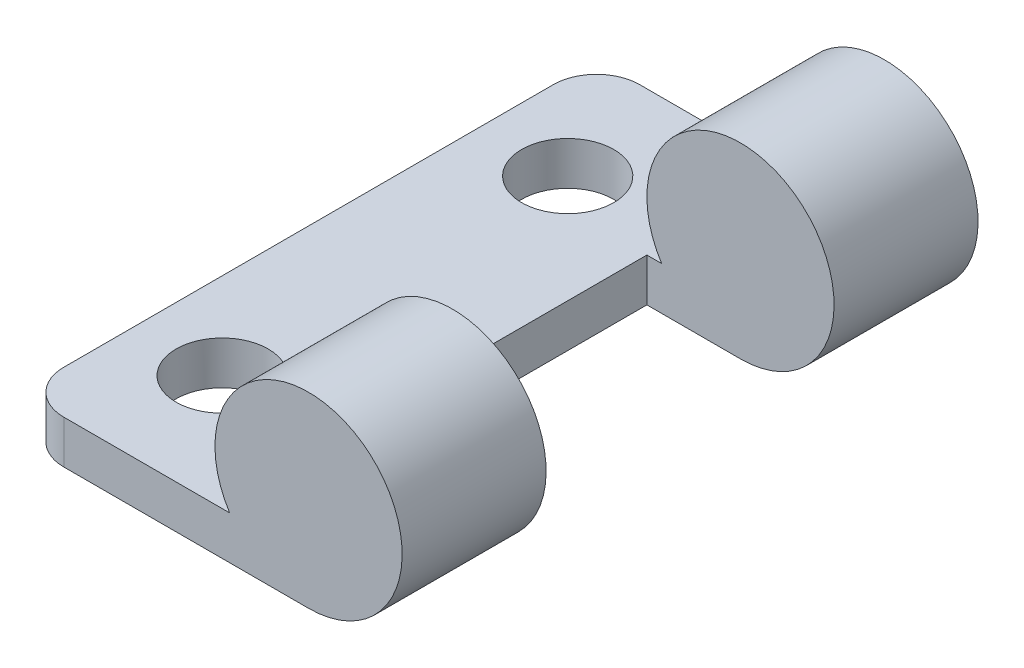
ISO-10303-21;
HEADER;
FILE_DESCRIPTION(('STEP AP214'),'2;1');
FILE_NAME('part.step','',(''),(''),'','','');
FILE_SCHEMA(('AUTOMOTIVE_DESIGN { 1 0 10303 214 1 1 1 1 }'));
ENDSEC;
DATA;
#1=APPLICATION_CONTEXT('core data for automotive mechanical design processes');
#2=APPLICATION_PROTOCOL_DEFINITION('international standard','automotive_design',2000,#1);
#3=PRODUCT_CONTEXT('',#1,'mechanical');
#4=PRODUCT('Part','Part','',(#3));
#5=PRODUCT_RELATED_PRODUCT_CATEGORY('part','',(#4));
#6=PRODUCT_DEFINITION_FORMATION('','',#4);
#7=PRODUCT_DEFINITION_CONTEXT('part definition',#1,'design');
#8=PRODUCT_DEFINITION('design','',#6,#7);
#9=PRODUCT_DEFINITION_SHAPE('','',#8);
#10=(LENGTH_UNIT() NAMED_UNIT(*) SI_UNIT(.MILLI.,.METRE.));
#11=(NAMED_UNIT(*) PLANE_ANGLE_UNIT() SI_UNIT($,.RADIAN.));
#12=(NAMED_UNIT(*) SI_UNIT($,.STERADIAN.) SOLID_ANGLE_UNIT());
#13=UNCERTAINTY_MEASURE_WITH_UNIT(LENGTH_MEASURE(1.E-05),#10,'distance_accuracy_value','');
#14=(GEOMETRIC_REPRESENTATION_CONTEXT(3) GLOBAL_UNCERTAINTY_ASSIGNED_CONTEXT((#13)) GLOBAL_UNIT_ASSIGNED_CONTEXT((#10,
#11,#12)) REPRESENTATION_CONTEXT('',''));
#15=CARTESIAN_POINT('',(0.,0.,0.));
#16=DIRECTION('',(0.,0.,1.));
#17=DIRECTION('',(1.,0.,0.));
#18=AXIS2_PLACEMENT_3D('',#15,#16,#17);
#19=CARTESIAN_POINT('',(0.,0.,10.));
#20=DIRECTION('',(0.,0.,-1.));
#21=DIRECTION('',(-1.,0.,0.));
#22=AXIS2_PLACEMENT_3D('',#19,#20,#21);
#23=CYLINDRICAL_SURFACE('',#22,3.25);
#24=DIRECTION('',(0.,0.,-1.));
#25=VECTOR('',#24,1.);
#26=CARTESIAN_POINT('',(-2.73861278752583,-1.75,10.));
#27=LINE('',#26,#25);
#28=CARTESIAN_POINT('',(-2.73861278752583,-1.75,-5.));
#29=VERTEX_POINT('',#28);
#30=CARTESIAN_POINT('',(-2.73861278752583,-1.75,-10.));
#31=VERTEX_POINT('',#30);
#32=EDGE_CURVE('E188',#29,#31,#27,.T.);
#33=ORIENTED_EDGE('',*,*,#32,.F.);
#34=CARTESIAN_POINT('',(0.,0.,-5.));
#35=DIRECTION('',(0.,0.,-1.));
#36=DIRECTION('',(-1.,0.,0.));
#37=AXIS2_PLACEMENT_3D('',#34,#35,#36);
#38=CIRCLE('',#37,3.25);
#39=CARTESIAN_POINT('',(0.,-3.25,-5.));
#40=VERTEX_POINT('',#39);
#41=EDGE_CURVE('E163',#29,#40,#38,.T.);
#42=ORIENTED_EDGE('',*,*,#41,.T.);
#43=DIRECTION('',(0.,0.,-1.));
#44=VECTOR('',#43,1.);
#45=CARTESIAN_POINT('',(0.,-3.25,10.));
#46=LINE('',#45,#44);
#47=CARTESIAN_POINT('',(0.,-3.25,-10.));
#48=VERTEX_POINT('',#47);
#49=EDGE_CURVE('E175',#40,#48,#46,.T.);
#50=ORIENTED_EDGE('',*,*,#49,.T.);
#51=CARTESIAN_POINT('',(0.,0.,-10.));
#52=DIRECTION('',(0.,0.,1.));
#53=DIRECTION('',(1.,0.,0.));
#54=AXIS2_PLACEMENT_3D('',#51,#52,#53);
#55=CIRCLE('',#54,3.25);
#56=EDGE_CURVE('E166',#48,#31,#55,.T.);
#57=ORIENTED_EDGE('',*,*,#56,.T.);
#58=EDGE_LOOP('',(#33,#42,#50,#57));
#59=FACE_BOUND('',#58,.T.);
#60=ADVANCED_FACE('F36',(#59),#23,.T.);
#61=CARTESIAN_POINT('',(0.,0.,5.));
#62=DIRECTION('',(0.,0.,1.));
#63=DIRECTION('',(1.,0.,0.));
#64=AXIS2_PLACEMENT_3D('',#61,#62,#63);
#65=CIRCLE('',#64,3.25);
#66=CARTESIAN_POINT('',(0.,-3.25,5.));
#67=VERTEX_POINT('',#66);
#68=CARTESIAN_POINT('',(-2.73861278752583,-1.75,5.));
#69=VERTEX_POINT('',#68);
#70=EDGE_CURVE('E133',#67,#69,#65,.T.);
#71=ORIENTED_EDGE('',*,*,#70,.T.);
#72=CARTESIAN_POINT('',(-2.73861278752583,-1.75,10.));
#73=VERTEX_POINT('',#72);
#74=EDGE_CURVE('E189',#73,#69,#27,.T.);
#75=ORIENTED_EDGE('',*,*,#74,.F.);
#76=CARTESIAN_POINT('',(0.,0.,10.));
#77=DIRECTION('',(0.,0.,1.));
#78=DIRECTION('',(1.,0.,0.));
#79=AXIS2_PLACEMENT_3D('',#76,#77,#78);
#80=CIRCLE('',#79,3.25);
#81=CARTESIAN_POINT('',(0.,-3.25,10.));
#82=VERTEX_POINT('',#81);
#83=EDGE_CURVE('E167',#82,#73,#80,.T.);
#84=ORIENTED_EDGE('',*,*,#83,.F.);
#85=EDGE_CURVE('E181',#82,#67,#46,.T.);
#86=ORIENTED_EDGE('',*,*,#85,.T.);
#87=EDGE_LOOP('',(#71,#75,#84,#86));
#88=FACE_BOUND('',#87,.T.);
#89=ADVANCED_FACE('F222',(#88),#23,.T.);
#90=CARTESIAN_POINT('',(-10.,-1.75,10.));
#91=DIRECTION('',(0.,-1.,0.));
#92=DIRECTION('',(0.,0.,-1.));
#93=AXIS2_PLACEMENT_3D('',#90,#91,#92);
#94=PLANE('',#93);
#95=CARTESIAN_POINT('',(-7.,-1.75,-6.));
#96=DIRECTION('',(0.,-1.,0.));
#97=DIRECTION('',(0.,0.,-1.));
#98=AXIS2_PLACEMENT_3D('',#95,#96,#97);
#99=CIRCLE('',#98,1.6);
#100=CARTESIAN_POINT('',(-7.,-1.75,-7.6));
#101=VERTEX_POINT('',#100);
#102=EDGE_CURVE('E154',#101,#101,#99,.T.);
#103=ORIENTED_EDGE('',*,*,#102,.T.);
#104=EDGE_LOOP('',(#103));
#105=FACE_BOUND('',#104,.T.);
#106=CARTESIAN_POINT('',(-7.,-1.75,6.));
#107=DIRECTION('',(0.,-1.,0.));
#108=DIRECTION('',(0.,0.,-1.));
#109=AXIS2_PLACEMENT_3D('',#106,#107,#108);
#110=CIRCLE('',#109,1.6);
#111=CARTESIAN_POINT('',(-7.,-1.75,4.4));
#112=VERTEX_POINT('',#111);
#113=EDGE_CURVE('E151',#112,#112,#110,.T.);
#114=ORIENTED_EDGE('',*,*,#113,.T.);
#115=EDGE_LOOP('',(#114));
#116=FACE_BOUND('',#115,.T.);
#117=DIRECTION('',(-1.,0.,0.));
#118=VECTOR('',#117,1.);
#119=CARTESIAN_POINT('',(-10.,-1.75,-10.));
#120=LINE('',#119,#118);
#121=CARTESIAN_POINT('',(-8.5,-1.75,-10.));
#122=VERTEX_POINT('',#121);
#123=EDGE_CURVE('E178',#31,#122,#120,.T.);
#124=ORIENTED_EDGE('',*,*,#123,.T.);
#125=CARTESIAN_POINT('',(-8.5,-1.75,-8.5));
#126=DIRECTION('',(0.,-1.,0.));
#127=DIRECTION('',(0.,0.,-1.));
#128=AXIS2_PLACEMENT_3D('',#125,#126,#127);
#129=CIRCLE('',#128,1.5);
#130=CARTESIAN_POINT('',(-10.,-1.75,-8.5));
#131=VERTEX_POINT('',#130);
#132=EDGE_CURVE('E44',#122,#131,#129,.F.);
#133=ORIENTED_EDGE('',*,*,#132,.T.);
#134=DIRECTION('',(0.,0.,-1.));
#135=VECTOR('',#134,1.);
#136=CARTESIAN_POINT('',(-10.,-1.75,10.));
#137=LINE('',#136,#135);
#138=CARTESIAN_POINT('',(-10.,-1.75,8.5));
#139=VERTEX_POINT('',#138);
#140=EDGE_CURVE('E185',#139,#131,#137,.T.);
#141=ORIENTED_EDGE('',*,*,#140,.F.);
#142=CARTESIAN_POINT('',(-8.5,-1.75,8.5));
#143=DIRECTION('',(0.,-1.,0.));
#144=DIRECTION('',(0.,0.,-1.));
#145=AXIS2_PLACEMENT_3D('',#142,#143,#144);
#146=CIRCLE('',#145,1.5);
#147=CARTESIAN_POINT('',(-8.5,-1.75,10.));
#148=VERTEX_POINT('',#147);
#149=EDGE_CURVE('E51',#139,#148,#146,.F.);
#150=ORIENTED_EDGE('',*,*,#149,.T.);
#151=DIRECTION('',(-1.,0.,0.));
#152=VECTOR('',#151,1.);
#153=CARTESIAN_POINT('',(-10.,-1.75,10.));
#154=LINE('',#153,#152);
#155=EDGE_CURVE('E170',#73,#148,#154,.T.);
#156=ORIENTED_EDGE('',*,*,#155,.F.);
#157=ORIENTED_EDGE('',*,*,#74,.T.);
#158=DIRECTION('',(-1.,0.,0.));
#159=VECTOR('',#158,1.);
#160=CARTESIAN_POINT('',(-10.,-1.75,5.));
#161=LINE('',#160,#159);
#162=CARTESIAN_POINT('',(-3.25,-1.75,5.));
#163=VERTEX_POINT('',#162);
#164=EDGE_CURVE('E157',#69,#163,#161,.T.);
#165=ORIENTED_EDGE('',*,*,#164,.T.);
#166=DIRECTION('',(0.,0.,-1.));
#167=VECTOR('',#166,1.);
#168=CARTESIAN_POINT('',(-3.25,-1.75,10.));
#169=LINE('',#168,#167);
#170=CARTESIAN_POINT('',(-3.25,-1.75,-5.));
#171=VERTEX_POINT('',#170);
#172=EDGE_CURVE('E124',#163,#171,#169,.T.);
#173=ORIENTED_EDGE('',*,*,#172,.T.);
#174=DIRECTION('',(1.,0.,0.));
#175=VECTOR('',#174,1.);
#176=CARTESIAN_POINT('',(-10.,-1.75,-5.));
#177=LINE('',#176,#175);
#178=EDGE_CURVE('E160',#171,#29,#177,.T.);
#179=ORIENTED_EDGE('',*,*,#178,.T.);
#180=ORIENTED_EDGE('',*,*,#32,.T.);
#181=EDGE_LOOP('',(#124,#133,#141,#150,#156,#157,#165,#173,#179,#180));
#182=FACE_BOUND('',#181,.T.);
#183=ADVANCED_FACE('F204',(#105,#116,#182),#94,.F.);
#184=CARTESIAN_POINT('',(-10.,-3.25,10.));
#185=DIRECTION('',(1.,0.,0.));
#186=DIRECTION('',(0.,0.,-1.));
#187=AXIS2_PLACEMENT_3D('',#184,#185,#186);
#188=PLANE('',#187);
#189=ORIENTED_EDGE('',*,*,#140,.T.);
#190=DIRECTION('',(0.,-1.,0.));
#191=VECTOR('',#190,1.);
#192=CARTESIAN_POINT('',(-10.,-3.25,-8.5));
#193=LINE('',#192,#191);
#194=CARTESIAN_POINT('',(-10.,-3.25,-8.5));
#195=VERTEX_POINT('',#194);
#196=EDGE_CURVE('E195',#131,#195,#193,.T.);
#197=ORIENTED_EDGE('',*,*,#196,.T.);
#198=DIRECTION('',(0.,0.,-1.));
#199=VECTOR('',#198,1.);
#200=CARTESIAN_POINT('',(-10.,-3.25,10.));
#201=LINE('',#200,#199);
#202=CARTESIAN_POINT('',(-10.,-3.25,8.5));
#203=VERTEX_POINT('',#202);
#204=EDGE_CURVE('E183',#203,#195,#201,.T.);
#205=ORIENTED_EDGE('',*,*,#204,.F.);
#206=DIRECTION('',(0.,-1.,0.));
#207=VECTOR('',#206,1.);
#208=CARTESIAN_POINT('',(-10.,-1.75,8.5));
#209=LINE('',#208,#207);
#210=EDGE_CURVE('E193',#203,#139,#209,.F.);
#211=ORIENTED_EDGE('',*,*,#210,.T.);
#212=EDGE_LOOP('',(#189,#197,#205,#211));
#213=FACE_BOUND('',#212,.T.);
#214=ADVANCED_FACE('F208',(#213),#188,.F.);
#215=CARTESIAN_POINT('',(0.,-3.25,10.));
#216=DIRECTION('',(0.,1.,0.));
#217=DIRECTION('',(-1.,0.,0.));
#218=AXIS2_PLACEMENT_3D('',#215,#216,#217);
#219=PLANE('',#218);
#220=CARTESIAN_POINT('',(-7.,-3.25,-6.));
#221=DIRECTION('',(0.,1.,0.));
#222=DIRECTION('',(0.,0.,-1.));
#223=AXIS2_PLACEMENT_3D('',#220,#221,#222);
#224=CIRCLE('',#223,1.6);
#225=CARTESIAN_POINT('',(-7.,-3.25,-7.6));
#226=VERTEX_POINT('',#225);
#227=EDGE_CURVE('E145',#226,#226,#224,.T.);
#228=ORIENTED_EDGE('',*,*,#227,.T.);
#229=EDGE_LOOP('',(#228));
#230=FACE_BOUND('',#229,.T.);
#231=CARTESIAN_POINT('',(-7.,-3.25,6.));
#232=DIRECTION('',(0.,1.,0.));
#233=DIRECTION('',(0.,0.,1.));
#234=AXIS2_PLACEMENT_3D('',#231,#232,#233);
#235=CIRCLE('',#234,1.6);
#236=CARTESIAN_POINT('',(-7.,-3.25,7.6));
#237=VERTEX_POINT('',#236);
#238=EDGE_CURVE('E148',#237,#237,#235,.T.);
#239=ORIENTED_EDGE('',*,*,#238,.T.);
#240=EDGE_LOOP('',(#239));
#241=FACE_BOUND('',#240,.T.);
#242=ORIENTED_EDGE('',*,*,#204,.T.);
#243=CARTESIAN_POINT('',(-8.5,-3.25,-8.5));
#244=DIRECTION('',(0.,1.,0.));
#245=DIRECTION('',(-1.,0.,0.));
#246=AXIS2_PLACEMENT_3D('',#243,#244,#245);
#247=CIRCLE('',#246,1.5);
#248=CARTESIAN_POINT('',(-8.5,-3.25,-10.));
#249=VERTEX_POINT('',#248);
#250=EDGE_CURVE('E200',#195,#249,#247,.F.);
#251=ORIENTED_EDGE('',*,*,#250,.T.);
#252=DIRECTION('',(1.,0.,0.));
#253=VECTOR('',#252,1.);
#254=CARTESIAN_POINT('',(0.,-3.25,-10.));
#255=LINE('',#254,#253);
#256=EDGE_CURVE('E171',#249,#48,#255,.T.);
#257=ORIENTED_EDGE('',*,*,#256,.T.);
#258=ORIENTED_EDGE('',*,*,#49,.F.);
#259=DIRECTION('',(-1.,0.,0.));
#260=VECTOR('',#259,1.);
#261=CARTESIAN_POINT('',(0.,-3.25,-5.));
#262=LINE('',#261,#260);
#263=CARTESIAN_POINT('',(-3.25,-3.25,-5.));
#264=VERTEX_POINT('',#263);
#265=EDGE_CURVE('E142',#40,#264,#262,.T.);
#266=ORIENTED_EDGE('',*,*,#265,.T.);
#267=DIRECTION('',(0.,0.,1.));
#268=VECTOR('',#267,1.);
#269=CARTESIAN_POINT('',(-3.25,-3.25,-5.));
#270=LINE('',#269,#268);
#271=CARTESIAN_POINT('',(-3.25,-3.25,5.));
#272=VERTEX_POINT('',#271);
#273=EDGE_CURVE('E121',#264,#272,#270,.T.);
#274=ORIENTED_EDGE('',*,*,#273,.T.);
#275=DIRECTION('',(1.,0.,0.));
#276=VECTOR('',#275,1.);
#277=CARTESIAN_POINT('',(3.25,-3.25,5.));
#278=LINE('',#277,#276);
#279=EDGE_CURVE('E129',#272,#67,#278,.T.);
#280=ORIENTED_EDGE('',*,*,#279,.T.);
#281=ORIENTED_EDGE('',*,*,#85,.F.);
#282=DIRECTION('',(1.,0.,0.));
#283=VECTOR('',#282,1.);
#284=CARTESIAN_POINT('',(0.,-3.25,10.));
#285=LINE('',#284,#283);
#286=CARTESIAN_POINT('',(-8.5,-3.25,10.));
#287=VERTEX_POINT('',#286);
#288=EDGE_CURVE('E173',#287,#82,#285,.T.);
#289=ORIENTED_EDGE('',*,*,#288,.F.);
#290=CARTESIAN_POINT('',(-8.5,-3.25,8.5));
#291=DIRECTION('',(0.,1.,0.));
#292=DIRECTION('',(-1.,0.,0.));
#293=AXIS2_PLACEMENT_3D('',#290,#291,#292);
#294=CIRCLE('',#293,1.5);
#295=EDGE_CURVE('E198',#287,#203,#294,.F.);
#296=ORIENTED_EDGE('',*,*,#295,.T.);
#297=EDGE_LOOP('',(#242,#251,#257,#258,#266,#274,#280,#281,#289,#296));
#298=FACE_BOUND('',#297,.T.);
#299=ADVANCED_FACE('F139',(#230,#241,#298),#219,.F.);
#300=CARTESIAN_POINT('',(0.,0.,10.));
#301=DIRECTION('',(0.,0.,1.));
#302=DIRECTION('',(1.,0.,0.));
#303=AXIS2_PLACEMENT_3D('',#300,#301,#302);
#304=PLANE('',#303);
#305=ORIENTED_EDGE('',*,*,#155,.T.);
#306=DIRECTION('',(0.,-1.,0.));
#307=VECTOR('',#306,1.);
#308=CARTESIAN_POINT('',(-8.5,-3.25,10.));
#309=LINE('',#308,#307);
#310=EDGE_CURVE('E11',#148,#287,#309,.T.);
#311=ORIENTED_EDGE('',*,*,#310,.T.);
#312=ORIENTED_EDGE('',*,*,#288,.T.);
#313=ORIENTED_EDGE('',*,*,#83,.T.);
#314=EDGE_LOOP('',(#305,#311,#312,#313));
#315=FACE_BOUND('',#314,.T.);
#316=ADVANCED_FACE('F225',(#315),#304,.T.);
#317=CARTESIAN_POINT('',(0.,0.,-10.));
#318=DIRECTION('',(0.,0.,1.));
#319=DIRECTION('',(1.,0.,0.));
#320=AXIS2_PLACEMENT_3D('',#317,#318,#319);
#321=PLANE('',#320);
#322=ORIENTED_EDGE('',*,*,#256,.F.);
#323=DIRECTION('',(0.,-1.,0.));
#324=VECTOR('',#323,1.);
#325=CARTESIAN_POINT('',(-8.5,0.,-10.));
#326=LINE('',#325,#324);
#327=EDGE_CURVE('E59',#249,#122,#326,.F.);
#328=ORIENTED_EDGE('',*,*,#327,.T.);
#329=ORIENTED_EDGE('',*,*,#123,.F.);
#330=ORIENTED_EDGE('',*,*,#56,.F.);
#331=EDGE_LOOP('',(#322,#328,#329,#330));
#332=FACE_BOUND('',#331,.T.);
#333=ADVANCED_FACE('F214',(#332),#321,.F.);
#334=CARTESIAN_POINT('',(-7.,-3.25,6.));
#335=DIRECTION('',(0.,1.,0.));
#336=DIRECTION('',(0.,0.,1.));
#337=AXIS2_PLACEMENT_3D('',#334,#335,#336);
#338=CYLINDRICAL_SURFACE('',#337,1.6);
#339=ORIENTED_EDGE('',*,*,#238,.F.);
#340=EDGE_LOOP('',(#339));
#341=FACE_BOUND('',#340,.T.);
#342=ORIENTED_EDGE('',*,*,#113,.F.);
#343=EDGE_LOOP('',(#342));
#344=FACE_BOUND('',#343,.T.);
#345=ADVANCED_FACE('F248',(#341,#344),#338,.F.);
#346=CARTESIAN_POINT('',(-7.,-3.25,-6.));
#347=DIRECTION('',(0.,1.,0.));
#348=DIRECTION('',(0.,0.,1.));
#349=AXIS2_PLACEMENT_3D('',#346,#347,#348);
#350=CYLINDRICAL_SURFACE('',#349,1.6);
#351=ORIENTED_EDGE('',*,*,#227,.F.);
#352=EDGE_LOOP('',(#351));
#353=FACE_BOUND('',#352,.T.);
#354=ORIENTED_EDGE('',*,*,#102,.F.);
#355=EDGE_LOOP('',(#354));
#356=FACE_BOUND('',#355,.T.);
#357=ADVANCED_FACE('F253',(#353,#356),#350,.F.);
#358=CARTESIAN_POINT('',(-3.25,-3.25,-5.));
#359=DIRECTION('',(-1.,0.,0.));
#360=DIRECTION('',(0.,0.,1.));
#361=AXIS2_PLACEMENT_3D('',#358,#359,#360);
#362=PLANE('',#361);
#363=DIRECTION('',(0.,1.,0.));
#364=VECTOR('',#363,1.);
#365=CARTESIAN_POINT('',(-3.25,-3.25,5.));
#366=LINE('',#365,#364);
#367=EDGE_CURVE('E116',#272,#163,#366,.T.);
#368=ORIENTED_EDGE('',*,*,#367,.F.);
#369=ORIENTED_EDGE('',*,*,#273,.F.);
#370=DIRECTION('',(0.,1.,0.));
#371=VECTOR('',#370,1.);
#372=CARTESIAN_POINT('',(-3.25,-3.25,-5.));
#373=LINE('',#372,#371);
#374=EDGE_CURVE('E128',#264,#171,#373,.T.);
#375=ORIENTED_EDGE('',*,*,#374,.T.);
#376=ORIENTED_EDGE('',*,*,#172,.F.);
#377=EDGE_LOOP('',(#368,#369,#375,#376));
#378=FACE_BOUND('',#377,.T.);
#379=ADVANCED_FACE('F118',(#378),#362,.F.);
#380=CARTESIAN_POINT('',(3.25,-3.25,-5.));
#381=DIRECTION('',(0.,0.,-1.));
#382=DIRECTION('',(-1.,0.,0.));
#383=AXIS2_PLACEMENT_3D('',#380,#381,#382);
#384=PLANE('',#383);
#385=ORIENTED_EDGE('',*,*,#41,.F.);
#386=ORIENTED_EDGE('',*,*,#178,.F.);
#387=ORIENTED_EDGE('',*,*,#374,.F.);
#388=ORIENTED_EDGE('',*,*,#265,.F.);
#389=EDGE_LOOP('',(#385,#386,#387,#388));
#390=FACE_BOUND('',#389,.T.);
#391=ADVANCED_FACE('F218',(#390),#384,.F.);
#392=CARTESIAN_POINT('',(3.25,-3.25,5.));
#393=DIRECTION('',(0.,0.,1.));
#394=DIRECTION('',(1.,0.,0.));
#395=AXIS2_PLACEMENT_3D('',#392,#393,#394);
#396=PLANE('',#395);
#397=ORIENTED_EDGE('',*,*,#279,.F.);
#398=ORIENTED_EDGE('',*,*,#367,.T.);
#399=ORIENTED_EDGE('',*,*,#164,.F.);
#400=ORIENTED_EDGE('',*,*,#70,.F.);
#401=EDGE_LOOP('',(#397,#398,#399,#400));
#402=FACE_BOUND('',#401,.T.);
#403=ADVANCED_FACE('F132',(#402),#396,.F.);
#404=CARTESIAN_POINT('',(-8.5,-3.25,-8.5));
#405=DIRECTION('',(0.,-1.,0.));
#406=DIRECTION('',(0.,0.,-1.));
#407=AXIS2_PLACEMENT_3D('',#404,#405,#406);
#408=CYLINDRICAL_SURFACE('',#407,1.5);
#409=ORIENTED_EDGE('',*,*,#132,.F.);
#410=ORIENTED_EDGE('',*,*,#327,.F.);
#411=ORIENTED_EDGE('',*,*,#250,.F.);
#412=ORIENTED_EDGE('',*,*,#196,.F.);
#413=EDGE_LOOP('',(#409,#410,#411,#412));
#414=FACE_BOUND('',#413,.T.);
#415=ADVANCED_FACE('F211',(#414),#408,.T.);
#416=CARTESIAN_POINT('',(-8.5,0.,8.5));
#417=DIRECTION('',(0.,1.,0.));
#418=DIRECTION('',(0.,0.,1.));
#419=AXIS2_PLACEMENT_3D('',#416,#417,#418);
#420=CYLINDRICAL_SURFACE('',#419,1.5);
#421=ORIENTED_EDGE('',*,*,#149,.F.);
#422=ORIENTED_EDGE('',*,*,#210,.F.);
#423=ORIENTED_EDGE('',*,*,#295,.F.);
#424=ORIENTED_EDGE('',*,*,#310,.F.);
#425=EDGE_LOOP('',(#421,#422,#423,#424));
#426=FACE_BOUND('',#425,.T.);
#427=ADVANCED_FACE('F38',(#426),#420,.T.);
#428=CLOSED_SHELL('',(#60,#89,#183,#214,#299,#316,#333,#345,#357,#379,#391,#403,#415,#427));
#429=MANIFOLD_SOLID_BREP('B2',#428);
#430=ADVANCED_BREP_SHAPE_REPRESENTATION('',(#18,#429),#14);
#431=SHAPE_DEFINITION_REPRESENTATION(#9,#430);
ENDSEC;
END-ISO-10303-21;
